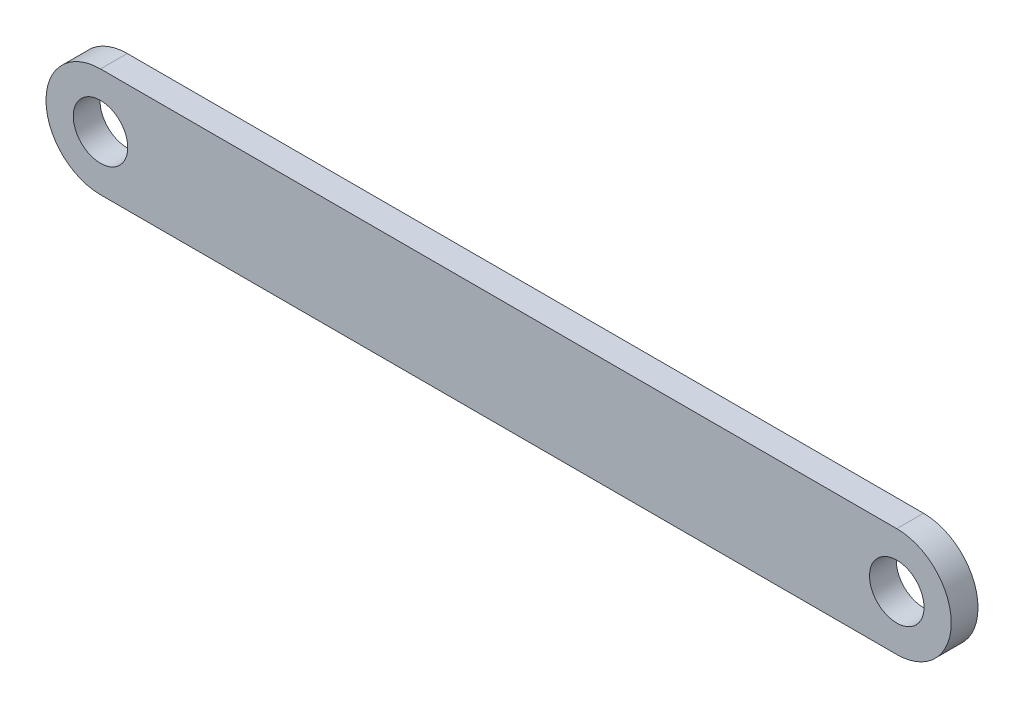
ISO-10303-21;
HEADER;
FILE_DESCRIPTION(('STEP AP214'),'2;1');
FILE_NAME('part.step','',(''),(''),'','','');
FILE_SCHEMA(('AUTOMOTIVE_DESIGN { 1 0 10303 214 1 1 1 1 }'));
ENDSEC;
DATA;
#1=APPLICATION_CONTEXT('core data for automotive mechanical design processes');
#2=APPLICATION_PROTOCOL_DEFINITION('international standard','automotive_design',2000,#1);
#3=PRODUCT_CONTEXT('',#1,'mechanical');
#4=PRODUCT('Part','Part','',(#3));
#5=PRODUCT_RELATED_PRODUCT_CATEGORY('part','',(#4));
#6=PRODUCT_DEFINITION_FORMATION('','',#4);
#7=PRODUCT_DEFINITION_CONTEXT('part definition',#1,'design');
#8=PRODUCT_DEFINITION('design','',#6,#7);
#9=PRODUCT_DEFINITION_SHAPE('','',#8);
#10=(LENGTH_UNIT() NAMED_UNIT(*) SI_UNIT(.MILLI.,.METRE.));
#11=(NAMED_UNIT(*) PLANE_ANGLE_UNIT() SI_UNIT($,.RADIAN.));
#12=(NAMED_UNIT(*) SI_UNIT($,.STERADIAN.) SOLID_ANGLE_UNIT());
#13=UNCERTAINTY_MEASURE_WITH_UNIT(LENGTH_MEASURE(1.E-05),#10,'distance_accuracy_value','');
#14=(GEOMETRIC_REPRESENTATION_CONTEXT(3) GLOBAL_UNCERTAINTY_ASSIGNED_CONTEXT((#13)) GLOBAL_UNIT_ASSIGNED_CONTEXT((#10,
#11,#12)) REPRESENTATION_CONTEXT('',''));
#15=CARTESIAN_POINT('',(0.,0.,0.));
#16=DIRECTION('',(0.,0.,1.));
#17=DIRECTION('',(1.,0.,0.));
#18=AXIS2_PLACEMENT_3D('',#15,#16,#17);
#19=CARTESIAN_POINT('',(0.,2.03803107941855,1.));
#20=DIRECTION('',(0.,1.,0.));
#21=DIRECTION('',(-1.,0.,0.));
#22=AXIS2_PLACEMENT_3D('',#19,#20,#21);
#23=PLANE('',#22);
#24=DIRECTION('',(1.,0.,0.));
#25=VECTOR('',#24,1.);
#26=CARTESIAN_POINT('',(0.,2.03803107941855,0.));
#27=LINE('',#26,#25);
#28=CARTESIAN_POINT('',(-29.77622,2.03803107941854,0.));
#29=VERTEX_POINT('',#28);
#30=CARTESIAN_POINT('',(0.,2.03803107941855,0.));
#31=VERTEX_POINT('',#30);
#32=EDGE_CURVE('E108',#29,#31,#27,.T.);
#33=ORIENTED_EDGE('',*,*,#32,.F.);
#34=DIRECTION('',(0.,0.,-1.));
#35=VECTOR('',#34,1.);
#36=CARTESIAN_POINT('',(-29.77622,2.03803107941854,1.));
#37=LINE('',#36,#35);
#38=CARTESIAN_POINT('',(-29.77622,2.03803107941854,1.));
#39=VERTEX_POINT('',#38);
#40=EDGE_CURVE('E11',#39,#29,#37,.T.);
#41=ORIENTED_EDGE('',*,*,#40,.F.);
#42=DIRECTION('',(1.,0.,0.));
#43=VECTOR('',#42,1.);
#44=CARTESIAN_POINT('',(0.,2.03803107941855,1.));
#45=LINE('',#44,#43);
#46=CARTESIAN_POINT('',(0.,2.03803107941855,1.));
#47=VERTEX_POINT('',#46);
#48=EDGE_CURVE('E90',#39,#47,#45,.T.);
#49=ORIENTED_EDGE('',*,*,#48,.T.);
#50=DIRECTION('',(0.,0.,-1.));
#51=VECTOR('',#50,1.);
#52=CARTESIAN_POINT('',(0.,2.03803107941855,1.));
#53=LINE('',#52,#51);
#54=EDGE_CURVE('E78',#47,#31,#53,.T.);
#55=ORIENTED_EDGE('',*,*,#54,.T.);
#56=EDGE_LOOP('',(#33,#41,#49,#55));
#57=FACE_BOUND('',#56,.T.);
#58=ADVANCED_FACE('F39',(#57),#23,.T.);
#59=CARTESIAN_POINT('',(-29.77622,0.,1.));
#60=DIRECTION('',(0.,0.,-1.));
#61=DIRECTION('',(-1.,0.,0.));
#62=AXIS2_PLACEMENT_3D('',#59,#60,#61);
#63=CYLINDRICAL_SURFACE('',#62,2.03803107941854);
#64=CARTESIAN_POINT('',(-29.77622,0.,0.));
#65=DIRECTION('',(0.,0.,1.));
#66=DIRECTION('',(1.,0.,0.));
#67=AXIS2_PLACEMENT_3D('',#64,#65,#66);
#68=CIRCLE('',#67,2.03803107941854);
#69=CARTESIAN_POINT('',(-29.77622,-2.03803107941855,0.));
#70=VERTEX_POINT('',#69);
#71=EDGE_CURVE('E95',#29,#70,#68,.T.);
#72=ORIENTED_EDGE('',*,*,#71,.T.);
#73=DIRECTION('',(0.,0.,-1.));
#74=VECTOR('',#73,1.);
#75=CARTESIAN_POINT('',(-29.77622,-2.03803107941855,1.));
#76=LINE('',#75,#74);
#77=CARTESIAN_POINT('',(-29.77622,-2.03803107941855,1.));
#78=VERTEX_POINT('',#77);
#79=EDGE_CURVE('E47',#78,#70,#76,.T.);
#80=ORIENTED_EDGE('',*,*,#79,.F.);
#81=CARTESIAN_POINT('',(-29.77622,0.,1.));
#82=DIRECTION('',(0.,0.,1.));
#83=DIRECTION('',(1.,0.,0.));
#84=AXIS2_PLACEMENT_3D('',#81,#82,#83);
#85=CIRCLE('',#84,2.03803107941854);
#86=EDGE_CURVE('E84',#39,#78,#85,.T.);
#87=ORIENTED_EDGE('',*,*,#86,.F.);
#88=ORIENTED_EDGE('',*,*,#40,.T.);
#89=EDGE_LOOP('',(#72,#80,#87,#88));
#90=FACE_BOUND('',#89,.T.);
#91=ADVANCED_FACE('F93',(#90),#63,.T.);
#92=CARTESIAN_POINT('',(0.,-2.03803107941855,1.));
#93=DIRECTION('',(0.,1.,0.));
#94=DIRECTION('',(-1.,0.,0.));
#95=AXIS2_PLACEMENT_3D('',#92,#93,#94);
#96=PLANE('',#95);
#97=DIRECTION('',(1.,0.,0.));
#98=VECTOR('',#97,1.);
#99=CARTESIAN_POINT('',(0.,-2.03803107941855,0.));
#100=LINE('',#99,#98);
#101=CARTESIAN_POINT('',(0.,-2.03803107941855,0.));
#102=VERTEX_POINT('',#101);
#103=EDGE_CURVE('E71',#70,#102,#100,.T.);
#104=ORIENTED_EDGE('',*,*,#103,.T.);
#105=DIRECTION('',(0.,0.,-1.));
#106=VECTOR('',#105,1.);
#107=CARTESIAN_POINT('',(0.,-2.03803107941855,1.));
#108=LINE('',#107,#106);
#109=CARTESIAN_POINT('',(0.,-2.03803107941855,1.));
#110=VERTEX_POINT('',#109);
#111=EDGE_CURVE('E96',#110,#102,#108,.T.);
#112=ORIENTED_EDGE('',*,*,#111,.F.);
#113=DIRECTION('',(1.,0.,0.));
#114=VECTOR('',#113,1.);
#115=CARTESIAN_POINT('',(0.,-2.03803107941855,1.));
#116=LINE('',#115,#114);
#117=EDGE_CURVE('E89',#78,#110,#116,.T.);
#118=ORIENTED_EDGE('',*,*,#117,.F.);
#119=ORIENTED_EDGE('',*,*,#79,.T.);
#120=EDGE_LOOP('',(#104,#112,#118,#119));
#121=FACE_BOUND('',#120,.T.);
#122=ADVANCED_FACE('F97',(#121),#96,.F.);
#123=CARTESIAN_POINT('',(0.,0.,1.));
#124=DIRECTION('',(0.,0.,-1.));
#125=DIRECTION('',(-1.,0.,0.));
#126=AXIS2_PLACEMENT_3D('',#123,#124,#125);
#127=CYLINDRICAL_SURFACE('',#126,1.01901553970927);
#128=CARTESIAN_POINT('',(0.,0.,1.));
#129=DIRECTION('',(0.,0.,1.));
#130=DIRECTION('',(1.,0.,0.));
#131=AXIS2_PLACEMENT_3D('',#128,#129,#130);
#132=CIRCLE('',#131,1.01901553970927);
#133=CARTESIAN_POINT('',(1.01901553970927,0.,1.));
#134=VERTEX_POINT('',#133);
#135=EDGE_CURVE('E99',#134,#134,#132,.T.);
#136=ORIENTED_EDGE('',*,*,#135,.T.);
#137=EDGE_LOOP('',(#136));
#138=FACE_BOUND('',#137,.T.);
#139=CARTESIAN_POINT('',(0.,0.,0.));
#140=DIRECTION('',(0.,0.,1.));
#141=DIRECTION('',(1.,0.,0.));
#142=AXIS2_PLACEMENT_3D('',#139,#140,#141);
#143=CIRCLE('',#142,1.01901553970927);
#144=CARTESIAN_POINT('',(1.01901553970927,0.,0.));
#145=VERTEX_POINT('',#144);
#146=EDGE_CURVE('E115',#145,#145,#143,.T.);
#147=ORIENTED_EDGE('',*,*,#146,.F.);
#148=EDGE_LOOP('',(#147));
#149=FACE_BOUND('',#148,.T.);
#150=ADVANCED_FACE('F135',(#138,#149),#127,.F.);
#151=CARTESIAN_POINT('',(0.,0.,1.));
#152=DIRECTION('',(0.,0.,-1.));
#153=DIRECTION('',(-1.,0.,0.));
#154=AXIS2_PLACEMENT_3D('',#151,#152,#153);
#155=CYLINDRICAL_SURFACE('',#154,2.03803107941855);
#156=CARTESIAN_POINT('',(0.,0.,0.));
#157=DIRECTION('',(0.,0.,1.));
#158=DIRECTION('',(1.,0.,0.));
#159=AXIS2_PLACEMENT_3D('',#156,#157,#158);
#160=CIRCLE('',#159,2.03803107941855);
#161=EDGE_CURVE('E113',#102,#31,#160,.T.);
#162=ORIENTED_EDGE('',*,*,#161,.T.);
#163=ORIENTED_EDGE('',*,*,#54,.F.);
#164=CARTESIAN_POINT('',(0.,0.,1.));
#165=DIRECTION('',(0.,0.,1.));
#166=DIRECTION('',(1.,0.,0.));
#167=AXIS2_PLACEMENT_3D('',#164,#165,#166);
#168=CIRCLE('',#167,2.03803107941855);
#169=EDGE_CURVE('E55',#110,#47,#168,.T.);
#170=ORIENTED_EDGE('',*,*,#169,.F.);
#171=ORIENTED_EDGE('',*,*,#111,.T.);
#172=EDGE_LOOP('',(#162,#163,#170,#171));
#173=FACE_BOUND('',#172,.T.);
#174=ADVANCED_FACE('F124',(#173),#155,.T.);
#175=CARTESIAN_POINT('',(-29.77622,0.,1.));
#176=DIRECTION('',(0.,0.,-1.));
#177=DIRECTION('',(-1.,0.,0.));
#178=AXIS2_PLACEMENT_3D('',#175,#176,#177);
#179=CYLINDRICAL_SURFACE('',#178,1.01901553970928);
#180=CARTESIAN_POINT('',(-29.77622,0.,1.));
#181=DIRECTION('',(0.,0.,1.));
#182=DIRECTION('',(1.,0.,0.));
#183=AXIS2_PLACEMENT_3D('',#180,#181,#182);
#184=CIRCLE('',#183,1.01901553970928);
#185=CARTESIAN_POINT('',(-28.7572044602907,0.,1.));
#186=VERTEX_POINT('',#185);
#187=EDGE_CURVE('E105',#186,#186,#184,.T.);
#188=ORIENTED_EDGE('',*,*,#187,.T.);
#189=EDGE_LOOP('',(#188));
#190=FACE_BOUND('',#189,.T.);
#191=CARTESIAN_POINT('',(-29.77622,0.,0.));
#192=DIRECTION('',(0.,0.,1.));
#193=DIRECTION('',(1.,0.,0.));
#194=AXIS2_PLACEMENT_3D('',#191,#192,#193);
#195=CIRCLE('',#194,1.01901553970928);
#196=CARTESIAN_POINT('',(-28.7572044602907,0.,0.));
#197=VERTEX_POINT('',#196);
#198=EDGE_CURVE('E118',#197,#197,#195,.T.);
#199=ORIENTED_EDGE('',*,*,#198,.F.);
#200=EDGE_LOOP('',(#199));
#201=FACE_BOUND('',#200,.T.);
#202=ADVANCED_FACE('F140',(#190,#201),#179,.F.);
#203=CARTESIAN_POINT('',(0.,0.,1.));
#204=DIRECTION('',(0.,0.,1.));
#205=DIRECTION('',(1.,0.,0.));
#206=AXIS2_PLACEMENT_3D('',#203,#204,#205);
#207=PLANE('',#206);
#208=ORIENTED_EDGE('',*,*,#48,.F.);
#209=ORIENTED_EDGE('',*,*,#86,.T.);
#210=ORIENTED_EDGE('',*,*,#117,.T.);
#211=ORIENTED_EDGE('',*,*,#169,.T.);
#212=EDGE_LOOP('',(#208,#209,#210,#211));
#213=FACE_BOUND('',#212,.T.);
#214=ORIENTED_EDGE('',*,*,#135,.F.);
#215=EDGE_LOOP('',(#214));
#216=FACE_BOUND('',#215,.T.);
#217=ORIENTED_EDGE('',*,*,#187,.F.);
#218=EDGE_LOOP('',(#217));
#219=FACE_BOUND('',#218,.T.);
#220=ADVANCED_FACE('F86',(#213,#216,#219),#207,.T.);
#221=CARTESIAN_POINT('',(0.,0.,0.));
#222=DIRECTION('',(0.,0.,1.));
#223=DIRECTION('',(1.,0.,0.));
#224=AXIS2_PLACEMENT_3D('',#221,#222,#223);
#225=PLANE('',#224);
#226=ORIENTED_EDGE('',*,*,#32,.T.);
#227=ORIENTED_EDGE('',*,*,#161,.F.);
#228=ORIENTED_EDGE('',*,*,#103,.F.);
#229=ORIENTED_EDGE('',*,*,#71,.F.);
#230=EDGE_LOOP('',(#226,#227,#228,#229));
#231=FACE_BOUND('',#230,.T.);
#232=ORIENTED_EDGE('',*,*,#146,.T.);
#233=EDGE_LOOP('',(#232));
#234=FACE_BOUND('',#233,.T.);
#235=ORIENTED_EDGE('',*,*,#198,.T.);
#236=EDGE_LOOP('',(#235));
#237=FACE_BOUND('',#236,.T.);
#238=ADVANCED_FACE('F126',(#231,#234,#237),#225,.F.);
#239=CLOSED_SHELL('',(#58,#91,#122,#150,#174,#202,#220,#238));
#240=MANIFOLD_SOLID_BREP('B2',#239);
#241=ADVANCED_BREP_SHAPE_REPRESENTATION('',(#18,#240),#14);
#242=SHAPE_DEFINITION_REPRESENTATION(#9,#241);
ENDSEC;
END-ISO-10303-21;
